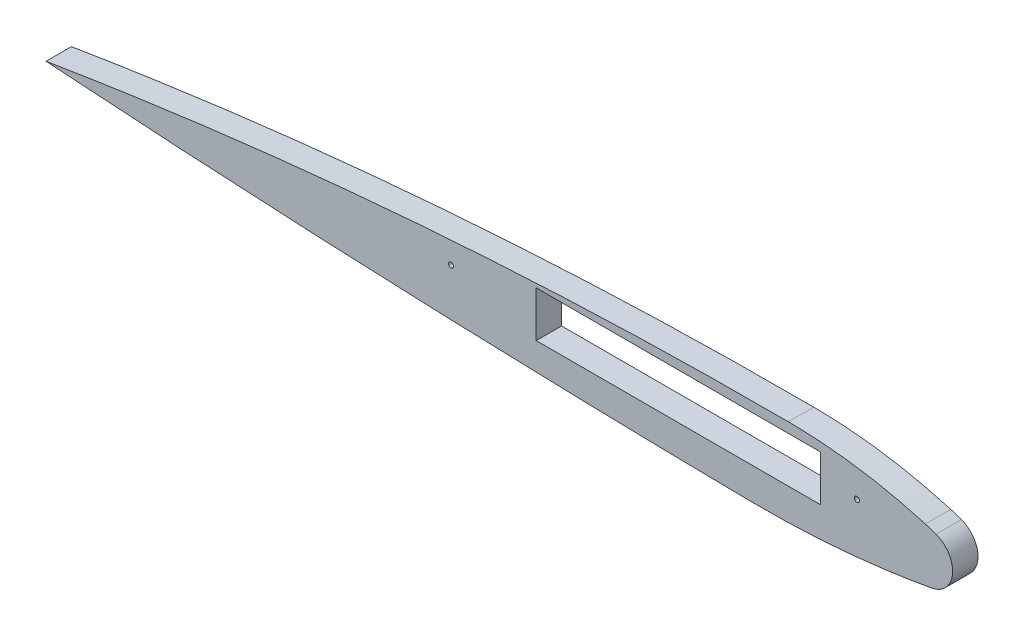
ISO-10303-21;
HEADER;
FILE_DESCRIPTION(('STEP AP214'),'2;1');
FILE_NAME('part.step','',(''),(''),'','','');
FILE_SCHEMA(('AUTOMOTIVE_DESIGN { 1 0 10303 214 1 1 1 1 }'));
ENDSEC;
DATA;
#1=APPLICATION_CONTEXT('core data for automotive mechanical design processes');
#2=APPLICATION_PROTOCOL_DEFINITION('international standard','automotive_design',2000,#1);
#3=PRODUCT_CONTEXT('',#1,'mechanical');
#4=PRODUCT('Part','Part','',(#3));
#5=PRODUCT_RELATED_PRODUCT_CATEGORY('part','',(#4));
#6=PRODUCT_DEFINITION_FORMATION('','',#4);
#7=PRODUCT_DEFINITION_CONTEXT('part definition',#1,'design');
#8=PRODUCT_DEFINITION('design','',#6,#7);
#9=PRODUCT_DEFINITION_SHAPE('','',#8);
#10=(LENGTH_UNIT() NAMED_UNIT(*) SI_UNIT(.MILLI.,.METRE.));
#11=(NAMED_UNIT(*) PLANE_ANGLE_UNIT() SI_UNIT($,.RADIAN.));
#12=(NAMED_UNIT(*) SI_UNIT($,.STERADIAN.) SOLID_ANGLE_UNIT());
#13=UNCERTAINTY_MEASURE_WITH_UNIT(LENGTH_MEASURE(1.E-05),#10,'distance_accuracy_value','');
#14=(GEOMETRIC_REPRESENTATION_CONTEXT(3) GLOBAL_UNCERTAINTY_ASSIGNED_CONTEXT((#13)) GLOBAL_UNIT_ASSIGNED_CONTEXT((#10,
#11,#12)) REPRESENTATION_CONTEXT('',''));
#15=CARTESIAN_POINT('',(0.,0.,0.));
#16=DIRECTION('',(0.,0.,1.));
#17=DIRECTION('',(1.,0.,0.));
#18=AXIS2_PLACEMENT_3D('',#15,#16,#17);
#19=CARTESIAN_POINT('',(36.2563303026578,-106.311961463395,6.35));
#20=DIRECTION('',(0.,0.,1.));
#21=DIRECTION('',(1.,0.,0.));
#22=AXIS2_PLACEMENT_3D('',#19,#20,#21);
#23=PLANE('',#22);
#24=CARTESIAN_POINT('',(-25.2914630612763,209.779210174929,6.35));
#25=DIRECTION('',(0.,0.,1.));
#26=DIRECTION('',(1.,0.,0.));
#27=AXIS2_PLACEMENT_3D('',#24,#25,#26);
#28=ELLIPSE('',#27,219.69885466917,203.701230916069);
#29=CARTESIAN_POINT('',(-28.2927042476808,6.09698698342909,6.35));
#30=VERTEX_POINT('',#29);
#31=CARTESIAN_POINT('',(17.4084463771385,9.96236755878013,6.35));
#32=VERTEX_POINT('',#31);
#33=EDGE_CURVE('E284',#30,#32,#28,.T.);
#34=ORIENTED_EDGE('',*,*,#33,.T.);
#35=CARTESIAN_POINT('',(16.2611044000867,16.2078544403366,6.35));
#36=DIRECTION('',(0.,0.,1.));
#37=DIRECTION('',(1.,0.,0.));
#38=AXIS2_PLACEMENT_3D('',#35,#36,#37);
#39=CIRCLE('',#38,6.35);
#40=CARTESIAN_POINT('',(18.4537211022759,22.1672950178809,6.35));
#41=VERTEX_POINT('',#40);
#42=EDGE_CURVE('E12',#32,#41,#39,.T.);
#43=ORIENTED_EDGE('',*,*,#42,.T.);
#44=CARTESIAN_POINT('',(3.66991363984412,-12.3757639930228,6.35));
#45=DIRECTION('',(0.,0.,1.));
#46=DIRECTION('',(1.,0.,0.));
#47=AXIS2_PLACEMENT_3D('',#44,#45,#46);
#48=ELLIPSE('',#47,40.081944161436,37.1633314861309);
#49=CARTESIAN_POINT('',(15.7959364600178,23.0460792093641,6.35));
#50=VERTEX_POINT('',#49);
#51=EDGE_CURVE('E145',#41,#50,#48,.T.);
#52=ORIENTED_EDGE('',*,*,#51,.T.);
#53=CARTESIAN_POINT('',(-19.0703046319003,-78.8031868962383,6.35));
#54=DIRECTION('',(0.,0.,1.));
#55=DIRECTION('',(1.,0.,0.));
#56=AXIS2_PLACEMENT_3D('',#53,#54,#55);
#57=ELLIPSE('',#56,115.248564949124,106.85660868282);
#58=CARTESIAN_POINT('',(-18.5133051802549,28.0521737928328,6.35));
#59=VERTEX_POINT('',#58);
#60=EDGE_CURVE('E123',#50,#59,#57,.T.);
#61=ORIENTED_EDGE('',*,*,#60,.T.);
#62=CARTESIAN_POINT('',(-23.5090756810409,-930.341693913225,6.35));
#63=DIRECTION('',(0.,0.,1.));
#64=DIRECTION('',(1.,0.,0.));
#65=AXIS2_PLACEMENT_3D('',#62,#63,#64);
#66=ELLIPSE('',#65,1033.67315590804,958.405061057029);
#67=CARTESIAN_POINT('',(-204.294256369334,13.2914062198968,6.35));
#68=VERTEX_POINT('',#67);
#69=EDGE_CURVE('E135',#59,#68,#66,.T.);
#70=ORIENTED_EDGE('',*,*,#69,.T.);
#71=CARTESIAN_POINT('',(3.97070538947494,2195.69893856267,6.35));
#72=DIRECTION('',(0.,0.,1.));
#73=DIRECTION('',(0.999969321883776,-0.00783296184731889,0.));
#74=AXIS2_PLACEMENT_3D('',#71,#72,#73);
#75=ELLIPSE('',#74,2616.55390755447,2189.82401671418);
#76=EDGE_CURVE('E141',#68,#30,#75,.T.);
#77=ORIENTED_EDGE('',*,*,#76,.T.);
#78=EDGE_LOOP('',(#34,#43,#52,#61,#70,#77));
#79=FACE_BOUND('',#78,.T.);
#80=CARTESIAN_POINT('',(-1.34369027727303,19.812,6.35));
#81=DIRECTION('',(0.,0.,1.));
#82=DIRECTION('',(1.,0.,0.));
#83=AXIS2_PLACEMENT_3D('',#80,#81,#82);
#84=CIRCLE('',#83,0.634999999999998);
#85=CARTESIAN_POINT('',(-0.708690277273036,19.812,6.35));
#86=VERTEX_POINT('',#85);
#87=EDGE_CURVE('E210',#86,#86,#84,.T.);
#88=ORIENTED_EDGE('',*,*,#87,.F.);
#89=EDGE_LOOP('',(#88));
#90=FACE_BOUND('',#89,.T.);
#91=DIRECTION('',(0.,-1.,0.));
#92=VECTOR('',#91,1.);
#93=CARTESIAN_POINT('',(-10.487690277273,25.527,6.35));
#94=LINE('',#93,#92);
#95=CARTESIAN_POINT('',(-10.487690277273,25.527,6.35));
#96=VERTEX_POINT('',#95);
#97=CARTESIAN_POINT('',(-10.487690277273,14.097,6.35));
#98=VERTEX_POINT('',#97);
#99=EDGE_CURVE('E217',#96,#98,#94,.T.);
#100=ORIENTED_EDGE('',*,*,#99,.T.);
#101=DIRECTION('',(-1.,0.,0.));
#102=VECTOR('',#101,1.);
#103=CARTESIAN_POINT('',(-10.487690277273,14.097,6.35));
#104=LINE('',#103,#102);
#105=CARTESIAN_POINT('',(-81.607690277273,14.097,6.35));
#106=VERTEX_POINT('',#105);
#107=EDGE_CURVE('E221',#98,#106,#104,.T.);
#108=ORIENTED_EDGE('',*,*,#107,.T.);
#109=DIRECTION('',(0.,1.,0.));
#110=VECTOR('',#109,1.);
#111=CARTESIAN_POINT('',(-81.607690277273,25.527,6.35));
#112=LINE('',#111,#110);
#113=CARTESIAN_POINT('',(-81.607690277273,25.527,6.35));
#114=VERTEX_POINT('',#113);
#115=EDGE_CURVE('E226',#106,#114,#112,.T.);
#116=ORIENTED_EDGE('',*,*,#115,.T.);
#117=DIRECTION('',(1.,0.,0.));
#118=VECTOR('',#117,1.);
#119=CARTESIAN_POINT('',(-10.487690277273,25.527,6.35));
#120=LINE('',#119,#118);
#121=EDGE_CURVE('E229',#114,#96,#120,.T.);
#122=ORIENTED_EDGE('',*,*,#121,.T.);
#123=EDGE_LOOP('',(#100,#108,#116,#122));
#124=FACE_BOUND('',#123,.T.);
#125=CARTESIAN_POINT('',(-102.943690277273,19.812,6.35));
#126=DIRECTION('',(0.,0.,1.));
#127=DIRECTION('',(1.,0.,0.));
#128=AXIS2_PLACEMENT_3D('',#125,#126,#127);
#129=CIRCLE('',#128,0.635000000000002);
#130=CARTESIAN_POINT('',(-102.308690277273,19.812,6.35));
#131=VERTEX_POINT('',#130);
#132=EDGE_CURVE('E205',#131,#131,#129,.T.);
#133=ORIENTED_EDGE('',*,*,#132,.F.);
#134=EDGE_LOOP('',(#133));
#135=FACE_BOUND('',#134,.T.);
#136=ADVANCED_FACE('F40',(#79,#90,#124,#135),#23,.T.);
#137=CARTESIAN_POINT('',(36.2563303026578,-106.311961463395,0.));
#138=DIRECTION('',(0.,0.,1.));
#139=DIRECTION('',(1.,0.,0.));
#140=AXIS2_PLACEMENT_3D('',#137,#138,#139);
#141=PLANE('',#140);
#142=CARTESIAN_POINT('',(3.66991363984412,-12.3757639930228,0.));
#143=DIRECTION('',(0.,0.,1.));
#144=DIRECTION('',(1.,0.,0.));
#145=AXIS2_PLACEMENT_3D('',#142,#143,#144);
#146=ELLIPSE('',#145,40.081944161436,37.1633314861309);
#147=CARTESIAN_POINT('',(18.4537211022759,22.1672950178809,0.));
#148=VERTEX_POINT('',#147);
#149=CARTESIAN_POINT('',(15.7959364600178,23.0460792093641,0.));
#150=VERTEX_POINT('',#149);
#151=EDGE_CURVE('E147',#148,#150,#146,.T.);
#152=ORIENTED_EDGE('',*,*,#151,.F.);
#153=CARTESIAN_POINT('',(16.2611044000867,16.2078544403366,0.));
#154=DIRECTION('',(0.,0.,1.));
#155=DIRECTION('',(1.,0.,0.));
#156=AXIS2_PLACEMENT_3D('',#153,#154,#155);
#157=CIRCLE('',#156,6.35);
#158=CARTESIAN_POINT('',(17.4084463771385,9.96236755878013,0.));
#159=VERTEX_POINT('',#158);
#160=EDGE_CURVE('E63',#148,#159,#157,.F.);
#161=ORIENTED_EDGE('',*,*,#160,.T.);
#162=CARTESIAN_POINT('',(-25.2914630612763,209.779210174929,0.));
#163=DIRECTION('',(0.,0.,1.));
#164=DIRECTION('',(1.,0.,0.));
#165=AXIS2_PLACEMENT_3D('',#162,#163,#164);
#166=ELLIPSE('',#165,219.69885466917,203.701230916069);
#167=CARTESIAN_POINT('',(-28.2927042476808,6.09698698342909,0.));
#168=VERTEX_POINT('',#167);
#169=EDGE_CURVE('E152',#168,#159,#166,.T.);
#170=ORIENTED_EDGE('',*,*,#169,.F.);
#171=CARTESIAN_POINT('',(3.97070538947494,2195.69893856267,0.));
#172=DIRECTION('',(0.,0.,1.));
#173=DIRECTION('',(0.999969321883776,-0.00783296184731889,0.));
#174=AXIS2_PLACEMENT_3D('',#171,#172,#173);
#175=ELLIPSE('',#174,2616.55390755447,2189.82401671418);
#176=CARTESIAN_POINT('',(-204.294256369334,13.2914062198968,0.));
#177=VERTEX_POINT('',#176);
#178=EDGE_CURVE('E267',#177,#168,#175,.T.);
#179=ORIENTED_EDGE('',*,*,#178,.F.);
#180=CARTESIAN_POINT('',(-23.5090756810409,-930.341693913225,0.));
#181=DIRECTION('',(0.,0.,1.));
#182=DIRECTION('',(1.,0.,0.));
#183=AXIS2_PLACEMENT_3D('',#180,#181,#182);
#184=ELLIPSE('',#183,1033.67315590804,958.405061057029);
#185=CARTESIAN_POINT('',(-18.5133051802549,28.0521737928328,0.));
#186=VERTEX_POINT('',#185);
#187=EDGE_CURVE('E271',#186,#177,#184,.T.);
#188=ORIENTED_EDGE('',*,*,#187,.F.);
#189=CARTESIAN_POINT('',(-19.0703046319003,-78.8031868962383,0.));
#190=DIRECTION('',(0.,0.,1.));
#191=DIRECTION('',(1.,0.,0.));
#192=AXIS2_PLACEMENT_3D('',#189,#190,#191);
#193=ELLIPSE('',#192,115.248564949124,106.85660868282);
#194=EDGE_CURVE('E126',#150,#186,#193,.T.);
#195=ORIENTED_EDGE('',*,*,#194,.F.);
#196=EDGE_LOOP('',(#152,#161,#170,#179,#188,#195));
#197=FACE_BOUND('',#196,.T.);
#198=CARTESIAN_POINT('',(-1.34369027727303,19.812,0.));
#199=DIRECTION('',(0.,0.,1.));
#200=DIRECTION('',(1.,0.,0.));
#201=AXIS2_PLACEMENT_3D('',#198,#199,#200);
#202=CIRCLE('',#201,0.634999999999998);
#203=CARTESIAN_POINT('',(-0.708690277273036,19.812,0.));
#204=VERTEX_POINT('',#203);
#205=EDGE_CURVE('E195',#204,#204,#202,.T.);
#206=ORIENTED_EDGE('',*,*,#205,.T.);
#207=EDGE_LOOP('',(#206));
#208=FACE_BOUND('',#207,.T.);
#209=DIRECTION('',(-1.,0.,0.));
#210=VECTOR('',#209,1.);
#211=CARTESIAN_POINT('',(-10.487690277273,14.097,0.));
#212=LINE('',#211,#210);
#213=CARTESIAN_POINT('',(-10.487690277273,14.097,0.));
#214=VERTEX_POINT('',#213);
#215=CARTESIAN_POINT('',(-81.607690277273,14.097,0.));
#216=VERTEX_POINT('',#215);
#217=EDGE_CURVE('E201',#214,#216,#212,.T.);
#218=ORIENTED_EDGE('',*,*,#217,.F.);
#219=DIRECTION('',(0.,-1.,0.));
#220=VECTOR('',#219,1.);
#221=CARTESIAN_POINT('',(-10.487690277273,25.527,0.));
#222=LINE('',#221,#220);
#223=CARTESIAN_POINT('',(-10.487690277273,25.527,0.));
#224=VERTEX_POINT('',#223);
#225=EDGE_CURVE('E214',#224,#214,#222,.T.);
#226=ORIENTED_EDGE('',*,*,#225,.F.);
#227=DIRECTION('',(1.,0.,0.));
#228=VECTOR('',#227,1.);
#229=CARTESIAN_POINT('',(-10.487690277273,25.527,0.));
#230=LINE('',#229,#228);
#231=CARTESIAN_POINT('',(-81.607690277273,25.527,0.));
#232=VERTEX_POINT('',#231);
#233=EDGE_CURVE('E222',#232,#224,#230,.T.);
#234=ORIENTED_EDGE('',*,*,#233,.F.);
#235=DIRECTION('',(0.,1.,0.));
#236=VECTOR('',#235,1.);
#237=CARTESIAN_POINT('',(-81.607690277273,25.527,0.));
#238=LINE('',#237,#236);
#239=EDGE_CURVE('E237',#216,#232,#238,.T.);
#240=ORIENTED_EDGE('',*,*,#239,.F.);
#241=EDGE_LOOP('',(#218,#226,#234,#240));
#242=FACE_BOUND('',#241,.T.);
#243=CARTESIAN_POINT('',(-102.943690277273,19.812,0.));
#244=DIRECTION('',(0.,0.,1.));
#245=DIRECTION('',(1.,0.,0.));
#246=AXIS2_PLACEMENT_3D('',#243,#244,#245);
#247=CIRCLE('',#246,0.635000000000002);
#248=CARTESIAN_POINT('',(-102.308690277273,19.812,0.));
#249=VERTEX_POINT('',#248);
#250=EDGE_CURVE('E131',#249,#249,#247,.T.);
#251=ORIENTED_EDGE('',*,*,#250,.T.);
#252=EDGE_LOOP('',(#251));
#253=FACE_BOUND('',#252,.T.);
#254=ADVANCED_FACE('F185',(#197,#208,#242,#253),#141,.F.);
#255=CARTESIAN_POINT('',(-10.487690277273,25.527,6.35));
#256=DIRECTION('',(1.,0.,0.));
#257=DIRECTION('',(0.,0.,-1.));
#258=AXIS2_PLACEMENT_3D('',#255,#256,#257);
#259=PLANE('',#258);
#260=ORIENTED_EDGE('',*,*,#225,.T.);
#261=DIRECTION('',(0.,0.,-1.));
#262=VECTOR('',#261,1.);
#263=CARTESIAN_POINT('',(-10.487690277273,14.097,6.35));
#264=LINE('',#263,#262);
#265=EDGE_CURVE('E232',#98,#214,#264,.T.);
#266=ORIENTED_EDGE('',*,*,#265,.F.);
#267=ORIENTED_EDGE('',*,*,#99,.F.);
#268=DIRECTION('',(0.,0.,-1.));
#269=VECTOR('',#268,1.);
#270=CARTESIAN_POINT('',(-10.487690277273,25.527,6.35));
#271=LINE('',#270,#269);
#272=EDGE_CURVE('E243',#96,#224,#271,.T.);
#273=ORIENTED_EDGE('',*,*,#272,.T.);
#274=EDGE_LOOP('',(#260,#266,#267,#273));
#275=FACE_BOUND('',#274,.T.);
#276=ADVANCED_FACE('F175',(#275),#259,.F.);
#277=CARTESIAN_POINT('',(-10.487690277273,25.527,6.35));
#278=DIRECTION('',(0.,1.,0.));
#279=DIRECTION('',(0.,0.,1.));
#280=AXIS2_PLACEMENT_3D('',#277,#278,#279);
#281=PLANE('',#280);
#282=ORIENTED_EDGE('',*,*,#233,.T.);
#283=ORIENTED_EDGE('',*,*,#272,.F.);
#284=ORIENTED_EDGE('',*,*,#121,.F.);
#285=DIRECTION('',(0.,0.,-1.));
#286=VECTOR('',#285,1.);
#287=CARTESIAN_POINT('',(-81.607690277273,25.527,6.35));
#288=LINE('',#287,#286);
#289=EDGE_CURVE('E246',#114,#232,#288,.T.);
#290=ORIENTED_EDGE('',*,*,#289,.T.);
#291=EDGE_LOOP('',(#282,#283,#284,#290));
#292=FACE_BOUND('',#291,.T.);
#293=ADVANCED_FACE('F171',(#292),#281,.F.);
#294=CARTESIAN_POINT('',(-81.607690277273,25.527,6.35));
#295=DIRECTION('',(-1.,0.,0.));
#296=DIRECTION('',(0.,0.,1.));
#297=AXIS2_PLACEMENT_3D('',#294,#295,#296);
#298=PLANE('',#297);
#299=ORIENTED_EDGE('',*,*,#239,.T.);
#300=ORIENTED_EDGE('',*,*,#289,.F.);
#301=ORIENTED_EDGE('',*,*,#115,.F.);
#302=DIRECTION('',(0.,0.,-1.));
#303=VECTOR('',#302,1.);
#304=CARTESIAN_POINT('',(-81.607690277273,14.097,6.35));
#305=LINE('',#304,#303);
#306=EDGE_CURVE('E248',#106,#216,#305,.T.);
#307=ORIENTED_EDGE('',*,*,#306,.T.);
#308=EDGE_LOOP('',(#299,#300,#301,#307));
#309=FACE_BOUND('',#308,.T.);
#310=ADVANCED_FACE('F174',(#309),#298,.F.);
#311=CARTESIAN_POINT('',(-10.487690277273,14.097,6.35));
#312=DIRECTION('',(0.,-1.,0.));
#313=DIRECTION('',(0.,0.,-1.));
#314=AXIS2_PLACEMENT_3D('',#311,#312,#313);
#315=PLANE('',#314);
#316=ORIENTED_EDGE('',*,*,#217,.T.);
#317=ORIENTED_EDGE('',*,*,#306,.F.);
#318=ORIENTED_EDGE('',*,*,#107,.F.);
#319=ORIENTED_EDGE('',*,*,#265,.T.);
#320=EDGE_LOOP('',(#316,#317,#318,#319));
#321=FACE_BOUND('',#320,.T.);
#322=ADVANCED_FACE('F169',(#321),#315,.F.);
#323=CARTESIAN_POINT('',(-1.34369027727303,19.812,6.35));
#324=DIRECTION('',(0.,0.,-1.));
#325=DIRECTION('',(-1.,0.,0.));
#326=AXIS2_PLACEMENT_3D('',#323,#324,#325);
#327=CYLINDRICAL_SURFACE('',#326,0.634999999999998);
#328=ORIENTED_EDGE('',*,*,#87,.T.);
#329=EDGE_LOOP('',(#328));
#330=FACE_BOUND('',#329,.T.);
#331=ORIENTED_EDGE('',*,*,#205,.F.);
#332=EDGE_LOOP('',(#331));
#333=FACE_BOUND('',#332,.T.);
#334=ADVANCED_FACE('F165',(#330,#333),#327,.F.);
#335=CARTESIAN_POINT('',(-102.943690277273,19.812,6.35));
#336=DIRECTION('',(0.,0.,-1.));
#337=DIRECTION('',(-1.,0.,0.));
#338=AXIS2_PLACEMENT_3D('',#335,#336,#337);
#339=CYLINDRICAL_SURFACE('',#338,0.635000000000002);
#340=ORIENTED_EDGE('',*,*,#132,.T.);
#341=EDGE_LOOP('',(#340));
#342=FACE_BOUND('',#341,.T.);
#343=ORIENTED_EDGE('',*,*,#250,.F.);
#344=EDGE_LOOP('',(#343));
#345=FACE_BOUND('',#344,.T.);
#346=ADVANCED_FACE('F161',(#342,#345),#339,.F.);
#347=DIRECTION('',(0.,0.,-1.));
#348=VECTOR('',#347,1.);
#349=SURFACE_OF_LINEAR_EXTRUSION('',#57,#348);
#350=ORIENTED_EDGE('',*,*,#194,.T.);
#351=DIRECTION('',(0.,0.,-1.));
#352=VECTOR('',#351,1.);
#353=CARTESIAN_POINT('',(-18.5133051802549,28.0521737928328,6.35));
#354=LINE('',#353,#352);
#355=EDGE_CURVE('E118',#59,#186,#354,.T.);
#356=ORIENTED_EDGE('',*,*,#355,.F.);
#357=ORIENTED_EDGE('',*,*,#60,.F.);
#358=DIRECTION('',(0.,0.,-1.));
#359=VECTOR('',#358,1.);
#360=CARTESIAN_POINT('',(15.7959364600178,23.0460792093641,6.35));
#361=LINE('',#360,#359);
#362=EDGE_CURVE('E281',#50,#150,#361,.T.);
#363=ORIENTED_EDGE('',*,*,#362,.T.);
#364=EDGE_LOOP('',(#350,#356,#357,#363));
#365=FACE_BOUND('',#364,.T.);
#366=ADVANCED_FACE('F120',(#365),#349,.F.);
#367=DIRECTION('',(0.,0.,-1.));
#368=VECTOR('',#367,1.);
#369=SURFACE_OF_LINEAR_EXTRUSION('',#66,#368);
#370=ORIENTED_EDGE('',*,*,#187,.T.);
#371=DIRECTION('',(0.,0.,-1.));
#372=VECTOR('',#371,1.);
#373=CARTESIAN_POINT('',(-204.294256369334,13.2914062198968,6.35));
#374=LINE('',#373,#372);
#375=EDGE_CURVE('E132',#68,#177,#374,.T.);
#376=ORIENTED_EDGE('',*,*,#375,.F.);
#377=ORIENTED_EDGE('',*,*,#69,.F.);
#378=ORIENTED_EDGE('',*,*,#355,.T.);
#379=EDGE_LOOP('',(#370,#376,#377,#378));
#380=FACE_BOUND('',#379,.T.);
#381=ADVANCED_FACE('F136',(#380),#369,.F.);
#382=DIRECTION('',(0.,0.,-1.));
#383=VECTOR('',#382,1.);
#384=SURFACE_OF_LINEAR_EXTRUSION('',#75,#383);
#385=ORIENTED_EDGE('',*,*,#178,.T.);
#386=DIRECTION('',(0.,0.,-1.));
#387=VECTOR('',#386,1.);
#388=CARTESIAN_POINT('',(-28.2927042476808,6.09698698342909,6.35));
#389=LINE('',#388,#387);
#390=EDGE_CURVE('E263',#30,#168,#389,.T.);
#391=ORIENTED_EDGE('',*,*,#390,.F.);
#392=ORIENTED_EDGE('',*,*,#76,.F.);
#393=ORIENTED_EDGE('',*,*,#375,.T.);
#394=EDGE_LOOP('',(#385,#391,#392,#393));
#395=FACE_BOUND('',#394,.T.);
#396=ADVANCED_FACE('F285',(#395),#384,.F.);
#397=DIRECTION('',(0.,0.,-1.));
#398=VECTOR('',#397,1.);
#399=SURFACE_OF_LINEAR_EXTRUSION('',#28,#398);
#400=ORIENTED_EDGE('',*,*,#169,.T.);
#401=DIRECTION('',(0.,0.,-1.));
#402=VECTOR('',#401,1.);
#403=CARTESIAN_POINT('',(17.4084463771385,9.96236755878013,0.));
#404=LINE('',#403,#402);
#405=EDGE_CURVE('E49',#159,#32,#404,.F.);
#406=ORIENTED_EDGE('',*,*,#405,.T.);
#407=ORIENTED_EDGE('',*,*,#33,.F.);
#408=ORIENTED_EDGE('',*,*,#390,.T.);
#409=EDGE_LOOP('',(#400,#406,#407,#408));
#410=FACE_BOUND('',#409,.T.);
#411=ADVANCED_FACE('F283',(#410),#399,.F.);
#412=DIRECTION('',(0.,0.,-1.));
#413=VECTOR('',#412,1.);
#414=SURFACE_OF_LINEAR_EXTRUSION('',#48,#413);
#415=ORIENTED_EDGE('',*,*,#51,.F.);
#416=DIRECTION('',(0.,0.,-1.));
#417=VECTOR('',#416,1.);
#418=CARTESIAN_POINT('',(18.4537211022759,22.1672950178809,6.35));
#419=LINE('',#418,#417);
#420=EDGE_CURVE('E245',#41,#148,#419,.T.);
#421=ORIENTED_EDGE('',*,*,#420,.T.);
#422=ORIENTED_EDGE('',*,*,#151,.T.);
#423=ORIENTED_EDGE('',*,*,#362,.F.);
#424=EDGE_LOOP('',(#415,#421,#422,#423));
#425=FACE_BOUND('',#424,.T.);
#426=ADVANCED_FACE('F296',(#425),#414,.F.);
#427=CARTESIAN_POINT('',(16.2611044000867,16.2078544403366,3.175));
#428=DIRECTION('',(0.,0.,-1.));
#429=DIRECTION('',(-1.,0.,0.));
#430=AXIS2_PLACEMENT_3D('',#427,#428,#429);
#431=CYLINDRICAL_SURFACE('',#430,6.35);
#432=ORIENTED_EDGE('',*,*,#42,.F.);
#433=ORIENTED_EDGE('',*,*,#405,.F.);
#434=ORIENTED_EDGE('',*,*,#160,.F.);
#435=ORIENTED_EDGE('',*,*,#420,.F.);
#436=EDGE_LOOP('',(#432,#433,#434,#435));
#437=FACE_BOUND('',#436,.T.);
#438=ADVANCED_FACE('F42',(#437),#431,.T.);
#439=CLOSED_SHELL('',(#136,#254,#276,#293,#310,#322,#334,#346,#366,#381,#396,#411,#426,#438));
#440=MANIFOLD_SOLID_BREP('B2',#439);
#441=ADVANCED_BREP_SHAPE_REPRESENTATION('',(#18,#440),#14);
#442=SHAPE_DEFINITION_REPRESENTATION(#9,#441);
ENDSEC;
END-ISO-10303-21;
